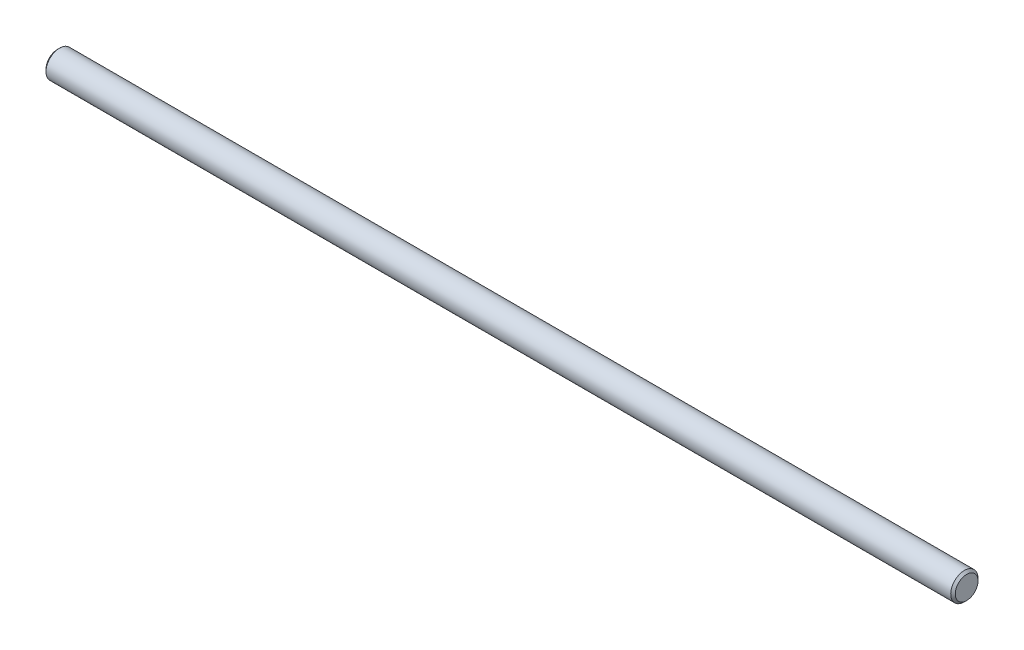
ISO-10303-21;
HEADER;
FILE_DESCRIPTION(('STEP AP214'),'2;1');
FILE_NAME('part.step','',(''),(''),'','','');
FILE_SCHEMA(('AUTOMOTIVE_DESIGN { 1 0 10303 214 1 1 1 1 }'));
ENDSEC;
DATA;
#1=APPLICATION_CONTEXT('core data for automotive mechanical design processes');
#2=APPLICATION_PROTOCOL_DEFINITION('international standard','automotive_design',2000,#1);
#3=PRODUCT_CONTEXT('',#1,'mechanical');
#4=PRODUCT('Part','Part','',(#3));
#5=PRODUCT_RELATED_PRODUCT_CATEGORY('part','',(#4));
#6=PRODUCT_DEFINITION_FORMATION('','',#4);
#7=PRODUCT_DEFINITION_CONTEXT('part definition',#1,'design');
#8=PRODUCT_DEFINITION('design','',#6,#7);
#9=PRODUCT_DEFINITION_SHAPE('','',#8);
#10=(LENGTH_UNIT() NAMED_UNIT(*) SI_UNIT(.MILLI.,.METRE.));
#11=(NAMED_UNIT(*) PLANE_ANGLE_UNIT() SI_UNIT($,.RADIAN.));
#12=(NAMED_UNIT(*) SI_UNIT($,.STERADIAN.) SOLID_ANGLE_UNIT());
#13=UNCERTAINTY_MEASURE_WITH_UNIT(LENGTH_MEASURE(1.E-05),#10,'distance_accuracy_value','');
#14=(GEOMETRIC_REPRESENTATION_CONTEXT(3) GLOBAL_UNCERTAINTY_ASSIGNED_CONTEXT((#13)) GLOBAL_UNIT_ASSIGNED_CONTEXT((#10,
#11,#12)) REPRESENTATION_CONTEXT('',''));
#15=CARTESIAN_POINT('',(0.,0.,0.));
#16=DIRECTION('',(0.,0.,1.));
#17=DIRECTION('',(1.,0.,0.));
#18=AXIS2_PLACEMENT_3D('',#15,#16,#17);
#19=CARTESIAN_POINT('',(99.5,0.0730907825229222,0.));
#20=DIRECTION('',(-1.,0.,0.));
#21=DIRECTION('',(0.,-1.,0.));
#22=AXIS2_PLACEMENT_3D('',#19,#20,#21);
#23=CONICAL_SURFACE('',#22,2.99999999999998,0.785398163397429);
#24=CARTESIAN_POINT('',(100.,0.0730907825229222,0.));
#25=DIRECTION('',(-1.,0.,0.));
#26=DIRECTION('',(0.,-1.,0.));
#27=AXIS2_PLACEMENT_3D('',#24,#25,#26);
#28=CIRCLE('',#27,2.5);
#29=CARTESIAN_POINT('',(100.,-2.42690921747708,0.));
#30=VERTEX_POINT('',#29);
#31=EDGE_CURVE('E58',#30,#30,#28,.T.);
#32=ORIENTED_EDGE('',*,*,#31,.T.);
#33=EDGE_LOOP('',(#32));
#34=FACE_BOUND('',#33,.T.);
#35=CARTESIAN_POINT('',(99.5,0.0730907825229222,0.));
#36=DIRECTION('',(-1.,0.,0.));
#37=DIRECTION('',(0.,-1.,0.));
#38=AXIS2_PLACEMENT_3D('',#35,#36,#37);
#39=CIRCLE('',#38,2.99999999999998);
#40=CARTESIAN_POINT('',(99.5,-2.92690921747706,0.));
#41=VERTEX_POINT('',#40);
#42=EDGE_CURVE('E10',#41,#41,#39,.T.);
#43=ORIENTED_EDGE('',*,*,#42,.F.);
#44=EDGE_LOOP('',(#43));
#45=FACE_BOUND('',#44,.T.);
#46=ADVANCED_FACE('F41',(#34,#45),#23,.T.);
#47=CARTESIAN_POINT('',(100.,0.0730907825229222,0.));
#48=DIRECTION('',(-1.,0.,0.));
#49=DIRECTION('',(0.,-1.,0.));
#50=AXIS2_PLACEMENT_3D('',#47,#48,#49);
#51=CYLINDRICAL_SURFACE('',#50,2.99999999999999);
#52=ORIENTED_EDGE('',*,*,#42,.T.);
#53=EDGE_LOOP('',(#52));
#54=FACE_BOUND('',#53,.T.);
#55=CARTESIAN_POINT('',(-99.5,0.0730907825229224,0.));
#56=DIRECTION('',(-1.,0.,0.));
#57=DIRECTION('',(0.,-1.,0.));
#58=AXIS2_PLACEMENT_3D('',#55,#56,#57);
#59=CIRCLE('',#58,3.);
#60=CARTESIAN_POINT('',(-99.5,-2.92690921747708,0.));
#61=VERTEX_POINT('',#60);
#62=EDGE_CURVE('E48',#61,#61,#59,.T.);
#63=ORIENTED_EDGE('',*,*,#62,.F.);
#64=EDGE_LOOP('',(#63));
#65=FACE_BOUND('',#64,.T.);
#66=ADVANCED_FACE('F78',(#54,#65),#51,.T.);
#67=CARTESIAN_POINT('',(-100.,0.0730907825229224,0.));
#68=DIRECTION('',(1.,0.,0.));
#69=DIRECTION('',(0.,1.,0.));
#70=AXIS2_PLACEMENT_3D('',#67,#68,#69);
#71=CONICAL_SURFACE('',#70,2.5,0.785398163397451);
#72=ORIENTED_EDGE('',*,*,#62,.T.);
#73=EDGE_LOOP('',(#72));
#74=FACE_BOUND('',#73,.T.);
#75=CARTESIAN_POINT('',(-100.,0.0730907825229224,0.));
#76=DIRECTION('',(-1.,0.,0.));
#77=DIRECTION('',(0.,-1.,0.));
#78=AXIS2_PLACEMENT_3D('',#75,#76,#77);
#79=CIRCLE('',#78,2.5);
#80=CARTESIAN_POINT('',(-100.,-2.42690921747708,0.));
#81=VERTEX_POINT('',#80);
#82=EDGE_CURVE('E53',#81,#81,#79,.T.);
#83=ORIENTED_EDGE('',*,*,#82,.F.);
#84=EDGE_LOOP('',(#83));
#85=FACE_BOUND('',#84,.T.);
#86=ADVANCED_FACE('F74',(#74,#85),#71,.T.);
#87=CARTESIAN_POINT('',(-100.,0.0730907825229224,0.));
#88=DIRECTION('',(-1.,0.,0.));
#89=DIRECTION('',(0.,-1.,0.));
#90=AXIS2_PLACEMENT_3D('',#87,#88,#89);
#91=PLANE('',#90);
#92=ORIENTED_EDGE('',*,*,#82,.T.);
#93=EDGE_LOOP('',(#92));
#94=FACE_BOUND('',#93,.T.);
#95=ADVANCED_FACE('F69',(#94),#91,.T.);
#96=CARTESIAN_POINT('',(100.,2.57309078252292,0.));
#97=DIRECTION('',(1.,0.,0.));
#98=DIRECTION('',(0.,1.,0.));
#99=AXIS2_PLACEMENT_3D('',#96,#97,#98);
#100=PLANE('',#99);
#101=ORIENTED_EDGE('',*,*,#31,.F.);
#102=EDGE_LOOP('',(#101));
#103=FACE_BOUND('',#102,.T.);
#104=ADVANCED_FACE('F67',(#103),#100,.T.);
#105=CLOSED_SHELL('',(#46,#66,#86,#95,#104));
#106=MANIFOLD_SOLID_BREP('B2',#105);
#107=ADVANCED_BREP_SHAPE_REPRESENTATION('',(#18,#106),#14);
#108=SHAPE_DEFINITION_REPRESENTATION(#9,#107);
ENDSEC;
END-ISO-10303-21;
